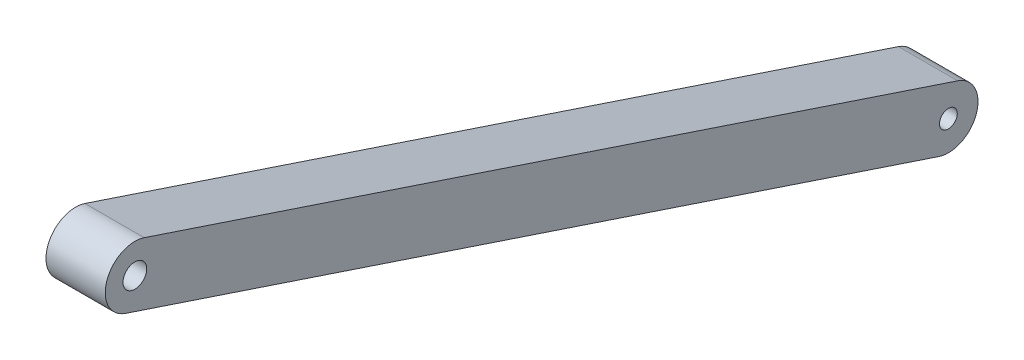
ISO-10303-21;
HEADER;
FILE_DESCRIPTION(('STEP AP214'),'2;1');
FILE_NAME('part.step','',(''),(''),'','','');
FILE_SCHEMA(('AUTOMOTIVE_DESIGN { 1 0 10303 214 1 1 1 1 }'));
ENDSEC;
DATA;
#1=APPLICATION_CONTEXT('core data for automotive mechanical design processes');
#2=APPLICATION_PROTOCOL_DEFINITION('international standard','automotive_design',2000,#1);
#3=PRODUCT_CONTEXT('',#1,'mechanical');
#4=PRODUCT('Part','Part','',(#3));
#5=PRODUCT_RELATED_PRODUCT_CATEGORY('part','',(#4));
#6=PRODUCT_DEFINITION_FORMATION('','',#4);
#7=PRODUCT_DEFINITION_CONTEXT('part definition',#1,'design');
#8=PRODUCT_DEFINITION('design','',#6,#7);
#9=PRODUCT_DEFINITION_SHAPE('','',#8);
#10=(LENGTH_UNIT() NAMED_UNIT(*) SI_UNIT(.MILLI.,.METRE.));
#11=(NAMED_UNIT(*) PLANE_ANGLE_UNIT() SI_UNIT($,.RADIAN.));
#12=(NAMED_UNIT(*) SI_UNIT($,.STERADIAN.) SOLID_ANGLE_UNIT());
#13=UNCERTAINTY_MEASURE_WITH_UNIT(LENGTH_MEASURE(1.E-05),#10,'distance_accuracy_value','');
#14=(GEOMETRIC_REPRESENTATION_CONTEXT(3) GLOBAL_UNCERTAINTY_ASSIGNED_CONTEXT((#13)) GLOBAL_UNIT_ASSIGNED_CONTEXT((#10,
#11,#12)) REPRESENTATION_CONTEXT('',''));
#15=CARTESIAN_POINT('',(0.,0.,0.));
#16=DIRECTION('',(0.,0.,1.));
#17=DIRECTION('',(1.,0.,0.));
#18=AXIS2_PLACEMENT_3D('',#15,#16,#17);
#19=CARTESIAN_POINT('',(-5.,85.7051553940905,122.259205921495));
#20=DIRECTION('',(1.,0.,0.));
#21=DIRECTION('',(0.,0.,-1.));
#22=AXIS2_PLACEMENT_3D('',#19,#20,#21);
#23=CYLINDRICAL_SURFACE('',#22,5.);
#24=DIRECTION('',(1.,0.,0.));
#25=VECTOR('',#24,1.);
#26=CARTESIAN_POINT('',(-5.,80.9612423488358,123.838854306125));
#27=LINE('',#26,#25);
#28=CARTESIAN_POINT('',(-5.,80.9612423488358,123.838854306125));
#29=VERTEX_POINT('',#28);
#30=CARTESIAN_POINT('',(5.,80.9612423488358,123.838854306125));
#31=VERTEX_POINT('',#30);
#32=EDGE_CURVE('E38',#29,#31,#27,.T.);
#33=ORIENTED_EDGE('',*,*,#32,.T.);
#34=CARTESIAN_POINT('',(5.,85.7051553940905,122.259205921495));
#35=DIRECTION('',(1.,0.,0.));
#36=DIRECTION('',(0.,0.,-1.));
#37=AXIS2_PLACEMENT_3D('',#34,#35,#36);
#38=CIRCLE('',#37,5.);
#39=CARTESIAN_POINT('',(5.,90.4490684393452,120.679557536866));
#40=VERTEX_POINT('',#39);
#41=EDGE_CURVE('E75',#40,#31,#38,.T.);
#42=ORIENTED_EDGE('',*,*,#41,.F.);
#43=DIRECTION('',(1.,0.,0.));
#44=VECTOR('',#43,1.);
#45=CARTESIAN_POINT('',(-5.,90.4490684393452,120.679557536866));
#46=LINE('',#45,#44);
#47=CARTESIAN_POINT('',(-5.,90.4490684393452,120.679557536866));
#48=VERTEX_POINT('',#47);
#49=EDGE_CURVE('E11',#48,#40,#46,.T.);
#50=ORIENTED_EDGE('',*,*,#49,.F.);
#51=CARTESIAN_POINT('',(-5.,85.7051553940905,122.259205921495));
#52=DIRECTION('',(1.,0.,0.));
#53=DIRECTION('',(0.,0.,-1.));
#54=AXIS2_PLACEMENT_3D('',#51,#52,#53);
#55=CIRCLE('',#54,5.);
#56=EDGE_CURVE('E76',#48,#29,#55,.T.);
#57=ORIENTED_EDGE('',*,*,#56,.T.);
#58=EDGE_LOOP('',(#33,#42,#50,#57));
#59=FACE_BOUND('',#58,.T.);
#60=ADVANCED_FACE('F35',(#59),#23,.T.);
#61=CARTESIAN_POINT('',(-5.,90.4490684393452,120.679557536866));
#62=DIRECTION('',(0.,0.948782609050934,-0.3159296769259));
#63=DIRECTION('',(0.,0.3159296769259,0.948782609050934));
#64=AXIS2_PLACEMENT_3D('',#61,#62,#63);
#65=PLANE('',#64);
#66=ORIENTED_EDGE('',*,*,#49,.T.);
#67=DIRECTION('',(0.,0.3159296769259,0.948782609050933));
#68=VECTOR('',#67,1.);
#69=CARTESIAN_POINT('',(5.,90.4490684393452,120.679557536866));
#70=LINE('',#69,#68);
#71=CARTESIAN_POINT('',(5.,44.7439130452547,-16.5796483846295));
#72=VERTEX_POINT('',#71);
#73=EDGE_CURVE('E93',#72,#40,#70,.T.);
#74=ORIENTED_EDGE('',*,*,#73,.F.);
#75=DIRECTION('',(1.,0.,0.));
#76=VECTOR('',#75,1.);
#77=CARTESIAN_POINT('',(-5.,44.7439130452547,-16.5796483846295));
#78=LINE('',#77,#76);
#79=CARTESIAN_POINT('',(-5.,44.7439130452547,-16.5796483846295));
#80=VERTEX_POINT('',#79);
#81=EDGE_CURVE('E43',#80,#72,#78,.T.);
#82=ORIENTED_EDGE('',*,*,#81,.F.);
#83=DIRECTION('',(0.,0.3159296769259,0.948782609050933));
#84=VECTOR('',#83,1.);
#85=CARTESIAN_POINT('',(-5.,90.4490684393452,120.679557536866));
#86=LINE('',#85,#84);
#87=EDGE_CURVE('E81',#80,#48,#86,.T.);
#88=ORIENTED_EDGE('',*,*,#87,.T.);
#89=EDGE_LOOP('',(#66,#74,#82,#88));
#90=FACE_BOUND('',#89,.T.);
#91=ADVANCED_FACE('F119',(#90),#65,.T.);
#92=CARTESIAN_POINT('',(-5.,40.,-14.9999999999998));
#93=DIRECTION('',(1.,0.,0.));
#94=DIRECTION('',(0.,0.,-1.));
#95=AXIS2_PLACEMENT_3D('',#92,#93,#94);
#96=CYLINDRICAL_SURFACE('',#95,5.);
#97=ORIENTED_EDGE('',*,*,#81,.T.);
#98=CARTESIAN_POINT('',(5.,40.,-14.9999999999998));
#99=DIRECTION('',(1.,0.,0.));
#100=DIRECTION('',(0.,0.,-1.));
#101=AXIS2_PLACEMENT_3D('',#98,#99,#100);
#102=CIRCLE('',#101,5.);
#103=CARTESIAN_POINT('',(5.,35.2560869547453,-13.4203516153705));
#104=VERTEX_POINT('',#103);
#105=EDGE_CURVE('E88',#104,#72,#102,.T.);
#106=ORIENTED_EDGE('',*,*,#105,.F.);
#107=DIRECTION('',(1.,0.,0.));
#108=VECTOR('',#107,1.);
#109=CARTESIAN_POINT('',(-5.,35.2560869547453,-13.4203516153705));
#110=LINE('',#109,#108);
#111=CARTESIAN_POINT('',(-5.,35.2560869547453,-13.4203516153705));
#112=VERTEX_POINT('',#111);
#113=EDGE_CURVE('E80',#112,#104,#110,.T.);
#114=ORIENTED_EDGE('',*,*,#113,.F.);
#115=CARTESIAN_POINT('',(-5.,40.,-14.9999999999998));
#116=DIRECTION('',(1.,0.,0.));
#117=DIRECTION('',(0.,0.,-1.));
#118=AXIS2_PLACEMENT_3D('',#115,#116,#117);
#119=CIRCLE('',#118,5.);
#120=EDGE_CURVE('E112',#112,#80,#119,.T.);
#121=ORIENTED_EDGE('',*,*,#120,.T.);
#122=EDGE_LOOP('',(#97,#106,#114,#121));
#123=FACE_BOUND('',#122,.T.);
#124=ADVANCED_FACE('F116',(#123),#96,.T.);
#125=CARTESIAN_POINT('',(-5.,80.9612423488358,123.838854306125));
#126=DIRECTION('',(0.,-0.948782609050934,0.3159296769259));
#127=DIRECTION('',(0.,-0.3159296769259,-0.948782609050934));
#128=AXIS2_PLACEMENT_3D('',#125,#126,#127);
#129=PLANE('',#128);
#130=ORIENTED_EDGE('',*,*,#113,.T.);
#131=DIRECTION('',(0.,-0.3159296769259,-0.948782609050933));
#132=VECTOR('',#131,1.);
#133=CARTESIAN_POINT('',(5.,80.9612423488358,123.838854306125));
#134=LINE('',#133,#132);
#135=EDGE_CURVE('E83',#31,#104,#134,.T.);
#136=ORIENTED_EDGE('',*,*,#135,.F.);
#137=ORIENTED_EDGE('',*,*,#32,.F.);
#138=DIRECTION('',(0.,-0.3159296769259,-0.948782609050933));
#139=VECTOR('',#138,1.);
#140=CARTESIAN_POINT('',(-5.,80.9612423488358,123.838854306125));
#141=LINE('',#140,#139);
#142=EDGE_CURVE('E110',#29,#112,#141,.T.);
#143=ORIENTED_EDGE('',*,*,#142,.T.);
#144=EDGE_LOOP('',(#130,#136,#137,#143));
#145=FACE_BOUND('',#144,.T.);
#146=ADVANCED_FACE('F84',(#145),#129,.T.);
#147=CARTESIAN_POINT('',(-5.,85.7051553940905,122.259205921495));
#148=DIRECTION('',(1.,0.,0.));
#149=DIRECTION('',(0.,0.,-1.));
#150=AXIS2_PLACEMENT_3D('',#147,#148,#149);
#151=PLANE('',#150);
#152=CARTESIAN_POINT('',(-5.,85.7051553940905,122.259205921495));
#153=DIRECTION('',(1.,0.,0.));
#154=DIRECTION('',(0.,0.,-1.));
#155=AXIS2_PLACEMENT_3D('',#152,#153,#154);
#156=CIRCLE('',#155,2.00000000000008);
#157=CARTESIAN_POINT('',(-5.,85.7051553940905,120.259205921495));
#158=VERTEX_POINT('',#157);
#159=EDGE_CURVE('E103',#158,#158,#156,.T.);
#160=ORIENTED_EDGE('',*,*,#159,.T.);
#161=EDGE_LOOP('',(#160));
#162=FACE_BOUND('',#161,.T.);
#163=CARTESIAN_POINT('',(-5.,40.,-14.9999999999998));
#164=DIRECTION('',(1.,0.,0.));
#165=DIRECTION('',(0.,0.,-1.));
#166=AXIS2_PLACEMENT_3D('',#163,#164,#165);
#167=CIRCLE('',#166,1.5);
#168=CARTESIAN_POINT('',(-5.,40.,-16.4999999999998));
#169=VERTEX_POINT('',#168);
#170=EDGE_CURVE('E106',#169,#169,#167,.T.);
#171=ORIENTED_EDGE('',*,*,#170,.T.);
#172=EDGE_LOOP('',(#171));
#173=FACE_BOUND('',#172,.T.);
#174=ORIENTED_EDGE('',*,*,#56,.F.);
#175=ORIENTED_EDGE('',*,*,#87,.F.);
#176=ORIENTED_EDGE('',*,*,#120,.F.);
#177=ORIENTED_EDGE('',*,*,#142,.F.);
#178=EDGE_LOOP('',(#174,#175,#176,#177));
#179=FACE_BOUND('',#178,.T.);
#180=ADVANCED_FACE('F121',(#162,#173,#179),#151,.F.);
#181=CARTESIAN_POINT('',(-5.,40.,-14.9999999999998));
#182=DIRECTION('',(1.,0.,0.));
#183=DIRECTION('',(0.,0.,-1.));
#184=AXIS2_PLACEMENT_3D('',#181,#182,#183);
#185=CYLINDRICAL_SURFACE('',#184,1.5);
#186=ORIENTED_EDGE('',*,*,#170,.F.);
#187=EDGE_LOOP('',(#186));
#188=FACE_BOUND('',#187,.T.);
#189=CARTESIAN_POINT('',(5.,40.,-14.9999999999998));
#190=DIRECTION('',(1.,0.,0.));
#191=DIRECTION('',(0.,0.,-1.));
#192=AXIS2_PLACEMENT_3D('',#189,#190,#191);
#193=CIRCLE('',#192,1.5);
#194=CARTESIAN_POINT('',(5.,40.,-16.4999999999998));
#195=VERTEX_POINT('',#194);
#196=EDGE_CURVE('E94',#195,#195,#193,.T.);
#197=ORIENTED_EDGE('',*,*,#196,.T.);
#198=EDGE_LOOP('',(#197));
#199=FACE_BOUND('',#198,.T.);
#200=ADVANCED_FACE('F123',(#188,#199),#185,.F.);
#201=CARTESIAN_POINT('',(-5.,85.7051553940905,122.259205921495));
#202=DIRECTION('',(1.,0.,0.));
#203=DIRECTION('',(0.,0.,-1.));
#204=AXIS2_PLACEMENT_3D('',#201,#202,#203);
#205=CYLINDRICAL_SURFACE('',#204,2.00000000000008);
#206=ORIENTED_EDGE('',*,*,#159,.F.);
#207=EDGE_LOOP('',(#206));
#208=FACE_BOUND('',#207,.T.);
#209=CARTESIAN_POINT('',(5.,85.7051553940905,122.259205921495));
#210=DIRECTION('',(1.,0.,0.));
#211=DIRECTION('',(0.,0.,-1.));
#212=AXIS2_PLACEMENT_3D('',#209,#210,#211);
#213=CIRCLE('',#212,2.00000000000008);
#214=CARTESIAN_POINT('',(5.,85.7051553940905,120.259205921495));
#215=VERTEX_POINT('',#214);
#216=EDGE_CURVE('E97',#215,#215,#213,.T.);
#217=ORIENTED_EDGE('',*,*,#216,.T.);
#218=EDGE_LOOP('',(#217));
#219=FACE_BOUND('',#218,.T.);
#220=ADVANCED_FACE('F130',(#208,#219),#205,.F.);
#221=CARTESIAN_POINT('',(5.,85.7051553940905,122.259205921495));
#222=DIRECTION('',(1.,0.,0.));
#223=DIRECTION('',(0.,0.,-1.));
#224=AXIS2_PLACEMENT_3D('',#221,#222,#223);
#225=PLANE('',#224);
#226=ORIENTED_EDGE('',*,*,#196,.F.);
#227=EDGE_LOOP('',(#226));
#228=FACE_BOUND('',#227,.T.);
#229=ORIENTED_EDGE('',*,*,#41,.T.);
#230=ORIENTED_EDGE('',*,*,#135,.T.);
#231=ORIENTED_EDGE('',*,*,#105,.T.);
#232=ORIENTED_EDGE('',*,*,#73,.T.);
#233=EDGE_LOOP('',(#229,#230,#231,#232));
#234=FACE_BOUND('',#233,.T.);
#235=ORIENTED_EDGE('',*,*,#216,.F.);
#236=EDGE_LOOP('',(#235));
#237=FACE_BOUND('',#236,.T.);
#238=ADVANCED_FACE('F91',(#228,#234,#237),#225,.T.);
#239=CLOSED_SHELL('',(#60,#91,#124,#146,#180,#200,#220,#238));
#240=MANIFOLD_SOLID_BREP('B2',#239);
#241=ADVANCED_BREP_SHAPE_REPRESENTATION('',(#18,#240),#14);
#242=SHAPE_DEFINITION_REPRESENTATION(#9,#241);
ENDSEC;
END-ISO-10303-21;
